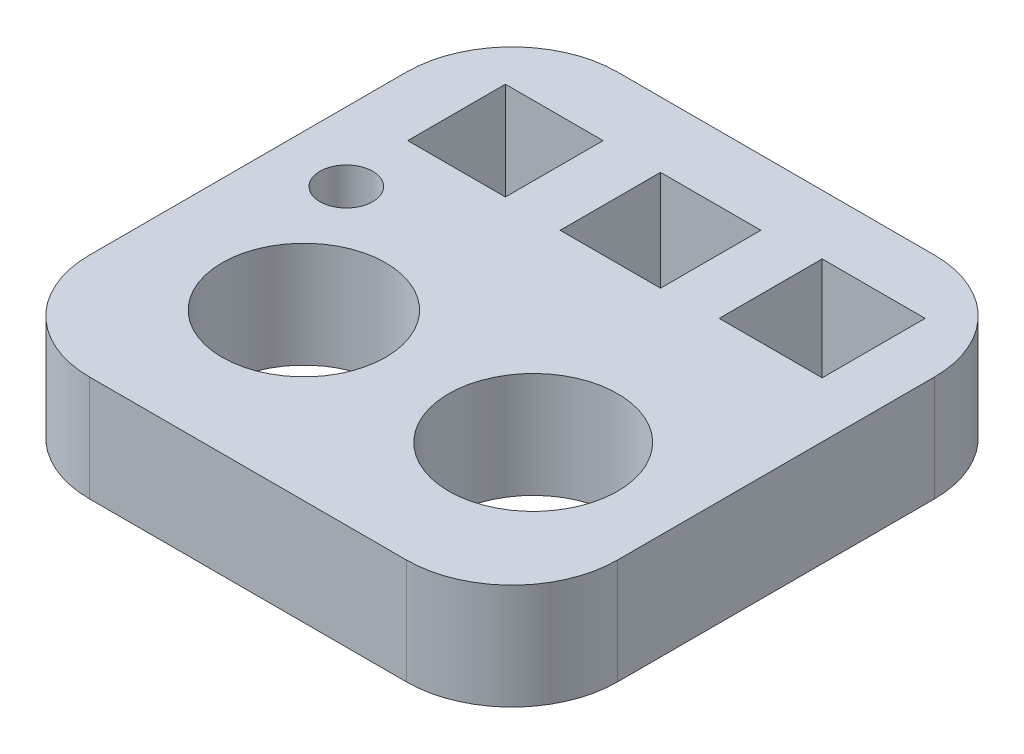
ISO-10303-21;
HEADER;
FILE_DESCRIPTION(('STEP AP214'),'2;1');
FILE_NAME('part.step','',(''),(''),'','','');
FILE_SCHEMA(('AUTOMOTIVE_DESIGN { 1 0 10303 214 1 1 1 1 }'));
ENDSEC;
DATA;
#1=APPLICATION_CONTEXT('core data for automotive mechanical design processes');
#2=APPLICATION_PROTOCOL_DEFINITION('international standard','automotive_design',2000,#1);
#3=PRODUCT_CONTEXT('',#1,'mechanical');
#4=PRODUCT('Part','Part','',(#3));
#5=PRODUCT_RELATED_PRODUCT_CATEGORY('part','',(#4));
#6=PRODUCT_DEFINITION_FORMATION('','',#4);
#7=PRODUCT_DEFINITION_CONTEXT('part definition',#1,'design');
#8=PRODUCT_DEFINITION('design','',#6,#7);
#9=PRODUCT_DEFINITION_SHAPE('','',#8);
#10=(LENGTH_UNIT() NAMED_UNIT(*) SI_UNIT(.MILLI.,.METRE.));
#11=(NAMED_UNIT(*) PLANE_ANGLE_UNIT() SI_UNIT($,.RADIAN.));
#12=(NAMED_UNIT(*) SI_UNIT($,.STERADIAN.) SOLID_ANGLE_UNIT());
#13=UNCERTAINTY_MEASURE_WITH_UNIT(LENGTH_MEASURE(1.E-05),#10,'distance_accuracy_value','');
#14=(GEOMETRIC_REPRESENTATION_CONTEXT(3) GLOBAL_UNCERTAINTY_ASSIGNED_CONTEXT((#13)) GLOBAL_UNIT_ASSIGNED_CONTEXT((#10,
#11,#12)) REPRESENTATION_CONTEXT('',''));
#15=CARTESIAN_POINT('',(0.,0.,0.));
#16=DIRECTION('',(0.,0.,1.));
#17=DIRECTION('',(1.,0.,0.));
#18=AXIS2_PLACEMENT_3D('',#15,#16,#17);
#19=CARTESIAN_POINT('',(-51.0166640577938,2.,33.2925280719129));
#20=DIRECTION('',(1.,0.,0.));
#21=DIRECTION('',(0.,0.,-1.));
#22=AXIS2_PLACEMENT_3D('',#19,#20,#21);
#23=PLANE('',#22);
#24=DIRECTION('',(0.,0.,1.));
#25=VECTOR('',#24,1.);
#26=CARTESIAN_POINT('',(-51.0166640577938,2.,33.2925280719129));
#27=LINE('',#26,#25);
#28=CARTESIAN_POINT('',(-51.0166640577938,2.,35.2925280719129));
#29=VERTEX_POINT('',#28);
#30=CARTESIAN_POINT('',(-51.0166640577938,2.,41.2925280719129));
#31=VERTEX_POINT('',#30);
#32=EDGE_CURVE('E284',#29,#31,#27,.T.);
#33=ORIENTED_EDGE('',*,*,#32,.F.);
#34=DIRECTION('',(0.,-1.,0.));
#35=VECTOR('',#34,1.);
#36=CARTESIAN_POINT('',(-51.0166640577938,2.,35.2925280719129));
#37=LINE('',#36,#35);
#38=CARTESIAN_POINT('',(-51.0166640577938,0.,35.2925280719129));
#39=VERTEX_POINT('',#38);
#40=EDGE_CURVE('E372',#29,#39,#37,.T.);
#41=ORIENTED_EDGE('',*,*,#40,.T.);
#42=DIRECTION('',(0.,0.,1.));
#43=VECTOR('',#42,1.);
#44=CARTESIAN_POINT('',(-51.0166640577938,0.,33.2925280719129));
#45=LINE('',#44,#43);
#46=CARTESIAN_POINT('',(-51.0166640577938,0.,41.2925280719129));
#47=VERTEX_POINT('',#46);
#48=EDGE_CURVE('E300',#39,#47,#45,.T.);
#49=ORIENTED_EDGE('',*,*,#48,.T.);
#50=DIRECTION('',(0.,-1.,0.));
#51=VECTOR('',#50,1.);
#52=CARTESIAN_POINT('',(-51.0166640577938,2.,41.2925280719129));
#53=LINE('',#52,#51);
#54=EDGE_CURVE('E369',#47,#31,#53,.F.);
#55=ORIENTED_EDGE('',*,*,#54,.T.);
#56=EDGE_LOOP('',(#33,#41,#49,#55));
#57=FACE_BOUND('',#56,.T.);
#58=ADVANCED_FACE('F45',(#57),#23,.F.);
#59=CARTESIAN_POINT('',(-51.0166640577938,2.,43.2925280719129));
#60=DIRECTION('',(0.,0.,-1.));
#61=DIRECTION('',(-1.,0.,0.));
#62=AXIS2_PLACEMENT_3D('',#59,#60,#61);
#63=PLANE('',#62);
#64=DIRECTION('',(1.,0.,0.));
#65=VECTOR('',#64,1.);
#66=CARTESIAN_POINT('',(-51.0166640577938,2.,43.2925280719129));
#67=LINE('',#66,#65);
#68=CARTESIAN_POINT('',(-49.0166640577938,2.,43.2925280719129));
#69=VERTEX_POINT('',#68);
#70=CARTESIAN_POINT('',(-43.0166640577938,2.,43.2925280719129));
#71=VERTEX_POINT('',#70);
#72=EDGE_CURVE('E288',#69,#71,#67,.T.);
#73=ORIENTED_EDGE('',*,*,#72,.F.);
#74=DIRECTION('',(0.,-1.,0.));
#75=VECTOR('',#74,1.);
#76=CARTESIAN_POINT('',(-49.0166640577938,2.,43.2925280719129));
#77=LINE('',#76,#75);
#78=CARTESIAN_POINT('',(-49.0166640577938,0.,43.2925280719129));
#79=VERTEX_POINT('',#78);
#80=EDGE_CURVE('E409',#69,#79,#77,.T.);
#81=ORIENTED_EDGE('',*,*,#80,.T.);
#82=DIRECTION('',(1.,0.,0.));
#83=VECTOR('',#82,1.);
#84=CARTESIAN_POINT('',(-51.0166640577938,0.,43.2925280719129));
#85=LINE('',#84,#83);
#86=CARTESIAN_POINT('',(-43.0166640577938,0.,43.2925280719129));
#87=VERTEX_POINT('',#86);
#88=EDGE_CURVE('E304',#79,#87,#85,.T.);
#89=ORIENTED_EDGE('',*,*,#88,.T.);
#90=DIRECTION('',(0.,-1.,0.));
#91=VECTOR('',#90,1.);
#92=CARTESIAN_POINT('',(-43.0166640577938,2.,43.2925280719129));
#93=LINE('',#92,#91);
#94=EDGE_CURVE('E406',#87,#71,#93,.F.);
#95=ORIENTED_EDGE('',*,*,#94,.T.);
#96=EDGE_LOOP('',(#73,#81,#89,#95));
#97=FACE_BOUND('',#96,.T.);
#98=ADVANCED_FACE('F444',(#97),#63,.F.);
#99=CARTESIAN_POINT('',(-41.0166640577938,2.,33.2925280719129));
#100=DIRECTION('',(-1.,0.,0.));
#101=DIRECTION('',(0.,0.,1.));
#102=AXIS2_PLACEMENT_3D('',#99,#100,#101);
#103=PLANE('',#102);
#104=DIRECTION('',(0.,0.,-1.));
#105=VECTOR('',#104,1.);
#106=CARTESIAN_POINT('',(-41.0166640577938,0.,33.2925280719129));
#107=LINE('',#106,#105);
#108=CARTESIAN_POINT('',(-41.0166640577938,0.,41.2925280719129));
#109=VERTEX_POINT('',#108);
#110=CARTESIAN_POINT('',(-41.0166640577938,0.,35.2925280719129));
#111=VERTEX_POINT('',#110);
#112=EDGE_CURVE('E309',#109,#111,#107,.T.);
#113=ORIENTED_EDGE('',*,*,#112,.T.);
#114=DIRECTION('',(0.,-1.,0.));
#115=VECTOR('',#114,1.);
#116=CARTESIAN_POINT('',(-41.0166640577938,2.,35.2925280719129));
#117=LINE('',#116,#115);
#118=CARTESIAN_POINT('',(-41.0166640577938,2.,35.2925280719129));
#119=VERTEX_POINT('',#118);
#120=EDGE_CURVE('E11',#111,#119,#117,.F.);
#121=ORIENTED_EDGE('',*,*,#120,.T.);
#122=DIRECTION('',(0.,0.,-1.));
#123=VECTOR('',#122,1.);
#124=CARTESIAN_POINT('',(-41.0166640577938,2.,33.2925280719129));
#125=LINE('',#124,#123);
#126=CARTESIAN_POINT('',(-41.0166640577938,2.,41.2925280719129));
#127=VERTEX_POINT('',#126);
#128=EDGE_CURVE('E292',#127,#119,#125,.T.);
#129=ORIENTED_EDGE('',*,*,#128,.F.);
#130=DIRECTION('',(0.,-1.,0.));
#131=VECTOR('',#130,1.);
#132=CARTESIAN_POINT('',(-41.0166640577938,2.,41.2925280719129));
#133=LINE('',#132,#131);
#134=EDGE_CURVE('E54',#127,#109,#133,.T.);
#135=ORIENTED_EDGE('',*,*,#134,.T.);
#136=EDGE_LOOP('',(#113,#121,#129,#135));
#137=FACE_BOUND('',#136,.T.);
#138=ADVANCED_FACE('F416',(#137),#103,.F.);
#139=CARTESIAN_POINT('',(-51.0166640577938,2.,33.2925280719129));
#140=DIRECTION('',(0.,0.,1.));
#141=DIRECTION('',(1.,0.,0.));
#142=AXIS2_PLACEMENT_3D('',#139,#140,#141);
#143=PLANE('',#142);
#144=DIRECTION('',(-1.,0.,0.));
#145=VECTOR('',#144,1.);
#146=CARTESIAN_POINT('',(-51.0166640577938,0.,33.2925280719129));
#147=LINE('',#146,#145);
#148=CARTESIAN_POINT('',(-43.0166640577938,0.,33.2925280719129));
#149=VERTEX_POINT('',#148);
#150=CARTESIAN_POINT('',(-49.0166640577938,0.,33.2925280719129));
#151=VERTEX_POINT('',#150);
#152=EDGE_CURVE('E289',#149,#151,#147,.T.);
#153=ORIENTED_EDGE('',*,*,#152,.T.);
#154=DIRECTION('',(0.,-1.,0.));
#155=VECTOR('',#154,1.);
#156=CARTESIAN_POINT('',(-49.0166640577938,2.,33.2925280719129));
#157=LINE('',#156,#155);
#158=CARTESIAN_POINT('',(-49.0166640577938,2.,33.2925280719129));
#159=VERTEX_POINT('',#158);
#160=EDGE_CURVE('E392',#151,#159,#157,.F.);
#161=ORIENTED_EDGE('',*,*,#160,.T.);
#162=DIRECTION('',(-1.,0.,0.));
#163=VECTOR('',#162,1.);
#164=CARTESIAN_POINT('',(-51.0166640577938,2.,33.2925280719129));
#165=LINE('',#164,#163);
#166=CARTESIAN_POINT('',(-43.0166640577938,2.,33.2925280719129));
#167=VERTEX_POINT('',#166);
#168=EDGE_CURVE('E295',#167,#159,#165,.T.);
#169=ORIENTED_EDGE('',*,*,#168,.F.);
#170=DIRECTION('',(0.,-1.,0.));
#171=VECTOR('',#170,1.);
#172=CARTESIAN_POINT('',(-43.0166640577938,2.,33.2925280719129));
#173=LINE('',#172,#171);
#174=EDGE_CURVE('E388',#167,#149,#173,.T.);
#175=ORIENTED_EDGE('',*,*,#174,.T.);
#176=EDGE_LOOP('',(#153,#161,#169,#175));
#177=FACE_BOUND('',#176,.T.);
#178=ADVANCED_FACE('F429',(#177),#143,.F.);
#179=CARTESIAN_POINT('',(0.,2.,0.));
#180=DIRECTION('',(0.,1.,0.));
#181=DIRECTION('',(0.,0.,1.));
#182=AXIS2_PLACEMENT_3D('',#179,#180,#181);
#183=PLANE('',#182);
#184=DIRECTION('',(0.,0.,1.));
#185=VECTOR('',#184,1.);
#186=CARTESIAN_POINT('',(-49.8807943546431,2.,34.5532077276569));
#187=LINE('',#186,#185);
#188=CARTESIAN_POINT('',(-49.8807943546431,2.,34.5532077276569));
#189=VERTEX_POINT('',#188);
#190=CARTESIAN_POINT('',(-49.8807943546431,2.,36.4032077276569));
#191=VERTEX_POINT('',#190);
#192=EDGE_CURVE('E187',#189,#191,#187,.T.);
#193=ORIENTED_EDGE('',*,*,#192,.F.);
#194=DIRECTION('',(-1.,0.,0.));
#195=VECTOR('',#194,1.);
#196=CARTESIAN_POINT('',(-49.8807943546431,2.,34.5532077276569));
#197=LINE('',#196,#195);
#198=CARTESIAN_POINT('',(-48.0307943546431,2.,34.5532077276569));
#199=VERTEX_POINT('',#198);
#200=EDGE_CURVE('E198',#199,#189,#197,.T.);
#201=ORIENTED_EDGE('',*,*,#200,.F.);
#202=DIRECTION('',(0.,0.,-1.));
#203=VECTOR('',#202,1.);
#204=CARTESIAN_POINT('',(-48.0307943546431,2.,34.5532077276569));
#205=LINE('',#204,#203);
#206=CARTESIAN_POINT('',(-48.0307943546431,2.,36.4032077276569));
#207=VERTEX_POINT('',#206);
#208=EDGE_CURVE('E205',#207,#199,#205,.T.);
#209=ORIENTED_EDGE('',*,*,#208,.F.);
#210=DIRECTION('',(1.,0.,0.));
#211=VECTOR('',#210,1.);
#212=CARTESIAN_POINT('',(-49.8807943546431,2.,36.4032077276569));
#213=LINE('',#212,#211);
#214=EDGE_CURVE('E212',#191,#207,#213,.T.);
#215=ORIENTED_EDGE('',*,*,#214,.F.);
#216=EDGE_LOOP('',(#193,#201,#209,#215));
#217=FACE_BOUND('',#216,.T.);
#218=DIRECTION('',(0.,0.,1.));
#219=VECTOR('',#218,1.);
#220=CARTESIAN_POINT('',(-46.9666640577938,2.,34.5299199576132));
#221=LINE('',#220,#219);
#222=CARTESIAN_POINT('',(-46.9666640577938,2.,34.5299199576132));
#223=VERTEX_POINT('',#222);
#224=CARTESIAN_POINT('',(-46.9666640577938,2.,36.4299199576132));
#225=VERTEX_POINT('',#224);
#226=EDGE_CURVE('E195',#223,#225,#221,.T.);
#227=ORIENTED_EDGE('',*,*,#226,.F.);
#228=DIRECTION('',(-1.,0.,0.));
#229=VECTOR('',#228,1.);
#230=CARTESIAN_POINT('',(-46.9666640577938,2.,34.5299199576132));
#231=LINE('',#230,#229);
#232=CARTESIAN_POINT('',(-45.0666640577938,2.,34.5299199576132));
#233=VERTEX_POINT('',#232);
#234=EDGE_CURVE('E227',#233,#223,#231,.T.);
#235=ORIENTED_EDGE('',*,*,#234,.F.);
#236=DIRECTION('',(0.,0.,-1.));
#237=VECTOR('',#236,1.);
#238=CARTESIAN_POINT('',(-45.0666640577938,2.,34.5299199576132));
#239=LINE('',#238,#237);
#240=CARTESIAN_POINT('',(-45.0666640577938,2.,36.4299199576132));
#241=VERTEX_POINT('',#240);
#242=EDGE_CURVE('E241',#241,#233,#239,.T.);
#243=ORIENTED_EDGE('',*,*,#242,.F.);
#244=DIRECTION('',(1.,0.,0.));
#245=VECTOR('',#244,1.);
#246=CARTESIAN_POINT('',(-46.9666640577938,2.,36.4299199576132));
#247=LINE('',#246,#245);
#248=EDGE_CURVE('E245',#225,#241,#247,.T.);
#249=ORIENTED_EDGE('',*,*,#248,.F.);
#250=EDGE_LOOP('',(#227,#235,#243,#249));
#251=FACE_BOUND('',#250,.T.);
#252=CARTESIAN_POINT('',(-48.0855125795582,2.,40.1647504945013));
#253=DIRECTION('',(0.,1.,0.));
#254=DIRECTION('',(0.,0.,1.));
#255=AXIS2_PLACEMENT_3D('',#252,#253,#254);
#256=CIRCLE('',#255,1.55);
#257=CARTESIAN_POINT('',(-48.0855125795582,2.,41.7147504945013));
#258=VERTEX_POINT('',#257);
#259=EDGE_CURVE('E237',#258,#258,#256,.T.);
#260=ORIENTED_EDGE('',*,*,#259,.F.);
#261=EDGE_LOOP('',(#260));
#262=FACE_BOUND('',#261,.T.);
#263=CARTESIAN_POINT('',(-43.7426404760196,2.,40.1647504945013));
#264=DIRECTION('',(0.,1.,0.));
#265=DIRECTION('',(0.,0.,1.));
#266=AXIS2_PLACEMENT_3D('',#263,#264,#265);
#267=CIRCLE('',#266,1.6);
#268=CARTESIAN_POINT('',(-43.7426404760196,2.,41.7647504945013));
#269=VERTEX_POINT('',#268);
#270=EDGE_CURVE('E254',#269,#269,#267,.T.);
#271=ORIENTED_EDGE('',*,*,#270,.F.);
#272=EDGE_LOOP('',(#271));
#273=FACE_BOUND('',#272,.T.);
#274=CARTESIAN_POINT('',(-49.7098151379683,2.,37.7368456177199));
#275=DIRECTION('',(0.,1.,0.));
#276=DIRECTION('',(0.,0.,1.));
#277=AXIS2_PLACEMENT_3D('',#274,#275,#276);
#278=CIRCLE('',#277,0.499999999999999);
#279=CARTESIAN_POINT('',(-49.7098151379683,2.,38.2368456177199));
#280=VERTEX_POINT('',#279);
#281=EDGE_CURVE('E257',#280,#280,#278,.T.);
#282=ORIENTED_EDGE('',*,*,#281,.F.);
#283=EDGE_LOOP('',(#282));
#284=FACE_BOUND('',#283,.T.);
#285=DIRECTION('',(0.,0.,1.));
#286=VECTOR('',#285,1.);
#287=CARTESIAN_POINT('',(-44.0162072226992,2.,34.4190118843219));
#288=LINE('',#287,#286);
#289=CARTESIAN_POINT('',(-44.0162072226992,2.,34.4190118843219));
#290=VERTEX_POINT('',#289);
#291=CARTESIAN_POINT('',(-44.0162072226992,2.,36.3690118843219));
#292=VERTEX_POINT('',#291);
#293=EDGE_CURVE('E214',#290,#292,#288,.T.);
#294=ORIENTED_EDGE('',*,*,#293,.F.);
#295=DIRECTION('',(-1.,0.,0.));
#296=VECTOR('',#295,1.);
#297=CARTESIAN_POINT('',(-44.0162072226992,2.,34.4190118843219));
#298=LINE('',#297,#296);
#299=CARTESIAN_POINT('',(-42.0662072226992,2.,34.4190118843219));
#300=VERTEX_POINT('',#299);
#301=EDGE_CURVE('E266',#300,#290,#298,.T.);
#302=ORIENTED_EDGE('',*,*,#301,.F.);
#303=DIRECTION('',(0.,0.,-1.));
#304=VECTOR('',#303,1.);
#305=CARTESIAN_POINT('',(-42.0662072226992,2.,34.4190118843219));
#306=LINE('',#305,#304);
#307=CARTESIAN_POINT('',(-42.0662072226992,2.,36.3690118843219));
#308=VERTEX_POINT('',#307);
#309=EDGE_CURVE('E262',#308,#300,#306,.T.);
#310=ORIENTED_EDGE('',*,*,#309,.F.);
#311=DIRECTION('',(1.,0.,0.));
#312=VECTOR('',#311,1.);
#313=CARTESIAN_POINT('',(-44.0162072226992,2.,36.3690118843219));
#314=LINE('',#313,#312);
#315=EDGE_CURVE('E218',#292,#308,#314,.T.);
#316=ORIENTED_EDGE('',*,*,#315,.F.);
#317=EDGE_LOOP('',(#294,#302,#310,#316));
#318=FACE_BOUND('',#317,.T.);
#319=ORIENTED_EDGE('',*,*,#168,.T.);
#320=CARTESIAN_POINT('',(-49.0166640577938,2.,35.2925280719129));
#321=DIRECTION('',(0.,1.,0.));
#322=DIRECTION('',(0.,0.,1.));
#323=AXIS2_PLACEMENT_3D('',#320,#321,#322);
#324=CIRCLE('',#323,2.);
#325=EDGE_CURVE('E403',#159,#29,#324,.T.);
#326=ORIENTED_EDGE('',*,*,#325,.T.);
#327=ORIENTED_EDGE('',*,*,#32,.T.);
#328=CARTESIAN_POINT('',(-49.0166640577938,2.,41.2925280719129));
#329=DIRECTION('',(0.,1.,0.));
#330=DIRECTION('',(0.,0.,1.));
#331=AXIS2_PLACEMENT_3D('',#328,#329,#330);
#332=CIRCLE('',#331,2.);
#333=EDGE_CURVE('E400',#31,#69,#332,.T.);
#334=ORIENTED_EDGE('',*,*,#333,.T.);
#335=ORIENTED_EDGE('',*,*,#72,.T.);
#336=CARTESIAN_POINT('',(-43.0166640577938,2.,41.2925280719129));
#337=DIRECTION('',(0.,1.,0.));
#338=DIRECTION('',(0.,0.,1.));
#339=AXIS2_PLACEMENT_3D('',#336,#337,#338);
#340=CIRCLE('',#339,2.);
#341=EDGE_CURVE('E66',#71,#127,#340,.T.);
#342=ORIENTED_EDGE('',*,*,#341,.T.);
#343=ORIENTED_EDGE('',*,*,#128,.T.);
#344=CARTESIAN_POINT('',(-43.0166640577938,2.,35.2925280719129));
#345=DIRECTION('',(0.,1.,0.));
#346=DIRECTION('',(0.,0.,1.));
#347=AXIS2_PLACEMENT_3D('',#344,#345,#346);
#348=CIRCLE('',#347,2.);
#349=EDGE_CURVE('E397',#119,#167,#348,.T.);
#350=ORIENTED_EDGE('',*,*,#349,.T.);
#351=EDGE_LOOP('',(#319,#326,#327,#334,#335,#342,#343,#350));
#352=FACE_BOUND('',#351,.T.);
#353=ADVANCED_FACE('F209',(#217,#251,#262,#273,#284,#318,#352),#183,.T.);
#354=CARTESIAN_POINT('',(0.,0.,0.));
#355=DIRECTION('',(0.,1.,0.));
#356=DIRECTION('',(0.,0.,1.));
#357=AXIS2_PLACEMENT_3D('',#354,#355,#356);
#358=PLANE('',#357);
#359=DIRECTION('',(-1.,0.,0.));
#360=VECTOR('',#359,1.);
#361=CARTESIAN_POINT('',(0.,0.,34.5532077276569));
#362=LINE('',#361,#360);
#363=CARTESIAN_POINT('',(-48.0307943546431,0.,34.5532077276569));
#364=VERTEX_POINT('',#363);
#365=CARTESIAN_POINT('',(-49.8807943546431,0.,34.5532077276569));
#366=VERTEX_POINT('',#365);
#367=EDGE_CURVE('E364',#364,#366,#362,.T.);
#368=ORIENTED_EDGE('',*,*,#367,.T.);
#369=DIRECTION('',(0.,0.,1.));
#370=VECTOR('',#369,1.);
#371=CARTESIAN_POINT('',(-49.8807943546431,0.,0.));
#372=LINE('',#371,#370);
#373=CARTESIAN_POINT('',(-49.8807943546431,0.,36.4032077276569));
#374=VERTEX_POINT('',#373);
#375=EDGE_CURVE('E190',#366,#374,#372,.T.);
#376=ORIENTED_EDGE('',*,*,#375,.T.);
#377=DIRECTION('',(1.,0.,0.));
#378=VECTOR('',#377,1.);
#379=CARTESIAN_POINT('',(0.,0.,36.4032077276569));
#380=LINE('',#379,#378);
#381=CARTESIAN_POINT('',(-48.0307943546431,0.,36.4032077276569));
#382=VERTEX_POINT('',#381);
#383=EDGE_CURVE('E356',#374,#382,#380,.T.);
#384=ORIENTED_EDGE('',*,*,#383,.T.);
#385=DIRECTION('',(0.,0.,-1.));
#386=VECTOR('',#385,1.);
#387=CARTESIAN_POINT('',(-48.0307943546431,0.,0.));
#388=LINE('',#387,#386);
#389=EDGE_CURVE('E360',#382,#364,#388,.T.);
#390=ORIENTED_EDGE('',*,*,#389,.T.);
#391=EDGE_LOOP('',(#368,#376,#384,#390));
#392=FACE_BOUND('',#391,.T.);
#393=DIRECTION('',(-1.,0.,0.));
#394=VECTOR('',#393,1.);
#395=CARTESIAN_POINT('',(0.,0.,34.5299199576132));
#396=LINE('',#395,#394);
#397=CARTESIAN_POINT('',(-45.0666640577938,0.,34.5299199576132));
#398=VERTEX_POINT('',#397);
#399=CARTESIAN_POINT('',(-46.9666640577938,0.,34.5299199576132));
#400=VERTEX_POINT('',#399);
#401=EDGE_CURVE('E348',#398,#400,#396,.T.);
#402=ORIENTED_EDGE('',*,*,#401,.T.);
#403=DIRECTION('',(0.,0.,1.));
#404=VECTOR('',#403,1.);
#405=CARTESIAN_POINT('',(-46.9666640577938,0.,0.));
#406=LINE('',#405,#404);
#407=CARTESIAN_POINT('',(-46.9666640577938,0.,36.4299199576132));
#408=VERTEX_POINT('',#407);
#409=EDGE_CURVE('E352',#400,#408,#406,.T.);
#410=ORIENTED_EDGE('',*,*,#409,.T.);
#411=DIRECTION('',(1.,0.,0.));
#412=VECTOR('',#411,1.);
#413=CARTESIAN_POINT('',(0.,0.,36.4299199576132));
#414=LINE('',#413,#412);
#415=CARTESIAN_POINT('',(-45.0666640577938,0.,36.4299199576132));
#416=VERTEX_POINT('',#415);
#417=EDGE_CURVE('E330',#408,#416,#414,.T.);
#418=ORIENTED_EDGE('',*,*,#417,.T.);
#419=DIRECTION('',(0.,0.,-1.));
#420=VECTOR('',#419,1.);
#421=CARTESIAN_POINT('',(-45.0666640577938,0.,0.));
#422=LINE('',#421,#420);
#423=EDGE_CURVE('E344',#416,#398,#422,.T.);
#424=ORIENTED_EDGE('',*,*,#423,.T.);
#425=EDGE_LOOP('',(#402,#410,#418,#424));
#426=FACE_BOUND('',#425,.T.);
#427=CARTESIAN_POINT('',(-48.0855125795582,0.,40.1647504945013));
#428=DIRECTION('',(0.,1.,0.));
#429=DIRECTION('',(0.,0.,1.));
#430=AXIS2_PLACEMENT_3D('',#427,#428,#429);
#431=CIRCLE('',#430,1.55);
#432=CARTESIAN_POINT('',(-48.0855125795582,0.,41.7147504945013));
#433=VERTEX_POINT('',#432);
#434=EDGE_CURVE('E305',#433,#433,#431,.T.);
#435=ORIENTED_EDGE('',*,*,#434,.T.);
#436=EDGE_LOOP('',(#435));
#437=FACE_BOUND('',#436,.T.);
#438=CARTESIAN_POINT('',(-43.7426404760196,0.,40.1647504945013));
#439=DIRECTION('',(0.,1.,0.));
#440=DIRECTION('',(0.,0.,1.));
#441=AXIS2_PLACEMENT_3D('',#438,#439,#440);
#442=CIRCLE('',#441,1.6);
#443=CARTESIAN_POINT('',(-43.7426404760196,0.,41.7647504945013));
#444=VERTEX_POINT('',#443);
#445=EDGE_CURVE('E334',#444,#444,#442,.T.);
#446=ORIENTED_EDGE('',*,*,#445,.T.);
#447=EDGE_LOOP('',(#446));
#448=FACE_BOUND('',#447,.T.);
#449=CARTESIAN_POINT('',(-49.7098151379683,0.,37.7368456177199));
#450=DIRECTION('',(0.,1.,0.));
#451=DIRECTION('',(0.,0.,1.));
#452=AXIS2_PLACEMENT_3D('',#449,#450,#451);
#453=CIRCLE('',#452,0.499999999999999);
#454=CARTESIAN_POINT('',(-49.7098151379683,0.,38.2368456177199));
#455=VERTEX_POINT('',#454);
#456=EDGE_CURVE('E274',#455,#455,#453,.T.);
#457=ORIENTED_EDGE('',*,*,#456,.T.);
#458=EDGE_LOOP('',(#457));
#459=FACE_BOUND('',#458,.T.);
#460=DIRECTION('',(-1.,0.,0.));
#461=VECTOR('',#460,1.);
#462=CARTESIAN_POINT('',(0.,0.,34.4190118843219));
#463=LINE('',#462,#461);
#464=CARTESIAN_POINT('',(-42.0662072226992,0.,34.4190118843219));
#465=VERTEX_POINT('',#464);
#466=CARTESIAN_POINT('',(-44.0162072226992,0.,34.4190118843219));
#467=VERTEX_POINT('',#466);
#468=EDGE_CURVE('E322',#465,#467,#463,.T.);
#469=ORIENTED_EDGE('',*,*,#468,.T.);
#470=DIRECTION('',(0.,0.,1.));
#471=VECTOR('',#470,1.);
#472=CARTESIAN_POINT('',(-44.0162072226992,0.,0.));
#473=LINE('',#472,#471);
#474=CARTESIAN_POINT('',(-44.0162072226992,0.,36.3690118843219));
#475=VERTEX_POINT('',#474);
#476=EDGE_CURVE('E326',#467,#475,#473,.T.);
#477=ORIENTED_EDGE('',*,*,#476,.T.);
#478=DIRECTION('',(1.,0.,0.));
#479=VECTOR('',#478,1.);
#480=CARTESIAN_POINT('',(0.,0.,36.3690118843219));
#481=LINE('',#480,#479);
#482=CARTESIAN_POINT('',(-42.0662072226992,0.,36.3690118843219));
#483=VERTEX_POINT('',#482);
#484=EDGE_CURVE('E299',#475,#483,#481,.T.);
#485=ORIENTED_EDGE('',*,*,#484,.T.);
#486=DIRECTION('',(0.,0.,-1.));
#487=VECTOR('',#486,1.);
#488=CARTESIAN_POINT('',(-42.0662072226992,0.,0.));
#489=LINE('',#488,#487);
#490=EDGE_CURVE('E318',#483,#465,#489,.T.);
#491=ORIENTED_EDGE('',*,*,#490,.T.);
#492=EDGE_LOOP('',(#469,#477,#485,#491));
#493=FACE_BOUND('',#492,.T.);
#494=ORIENTED_EDGE('',*,*,#48,.F.);
#495=CARTESIAN_POINT('',(-49.0166640577938,0.,35.2925280719129));
#496=DIRECTION('',(0.,1.,0.));
#497=DIRECTION('',(0.,0.,1.));
#498=AXIS2_PLACEMENT_3D('',#495,#496,#497);
#499=CIRCLE('',#498,2.);
#500=EDGE_CURVE('E385',#39,#151,#499,.F.);
#501=ORIENTED_EDGE('',*,*,#500,.T.);
#502=ORIENTED_EDGE('',*,*,#152,.F.);
#503=CARTESIAN_POINT('',(-43.0166640577938,0.,35.2925280719129));
#504=DIRECTION('',(0.,1.,0.));
#505=DIRECTION('',(0.,0.,1.));
#506=AXIS2_PLACEMENT_3D('',#503,#504,#505);
#507=CIRCLE('',#506,2.);
#508=EDGE_CURVE('E379',#149,#111,#507,.F.);
#509=ORIENTED_EDGE('',*,*,#508,.T.);
#510=ORIENTED_EDGE('',*,*,#112,.F.);
#511=CARTESIAN_POINT('',(-43.0166640577938,0.,41.2925280719129));
#512=DIRECTION('',(0.,1.,0.));
#513=DIRECTION('',(0.,0.,1.));
#514=AXIS2_PLACEMENT_3D('',#511,#512,#513);
#515=CIRCLE('',#514,2.);
#516=EDGE_CURVE('E376',#109,#87,#515,.F.);
#517=ORIENTED_EDGE('',*,*,#516,.T.);
#518=ORIENTED_EDGE('',*,*,#88,.F.);
#519=CARTESIAN_POINT('',(-49.0166640577938,0.,41.2925280719129));
#520=DIRECTION('',(0.,1.,0.));
#521=DIRECTION('',(0.,0.,1.));
#522=AXIS2_PLACEMENT_3D('',#519,#520,#521);
#523=CIRCLE('',#522,2.);
#524=EDGE_CURVE('E382',#79,#47,#523,.F.);
#525=ORIENTED_EDGE('',*,*,#524,.T.);
#526=EDGE_LOOP('',(#494,#501,#502,#509,#510,#517,#518,#525));
#527=FACE_BOUND('',#526,.T.);
#528=ADVANCED_FACE('F420',(#392,#426,#437,#448,#459,#493,#527),#358,.F.);
#529=CARTESIAN_POINT('',(-44.0162072226992,-8.,34.4190118843219));
#530=DIRECTION('',(-1.,0.,0.));
#531=DIRECTION('',(0.,0.,1.));
#532=AXIS2_PLACEMENT_3D('',#529,#530,#531);
#533=PLANE('',#532);
#534=DIRECTION('',(0.,1.,0.));
#535=VECTOR('',#534,1.);
#536=CARTESIAN_POINT('',(-44.0162072226992,-8.,34.4190118843219));
#537=LINE('',#536,#535);
#538=EDGE_CURVE('E271',#467,#290,#537,.T.);
#539=ORIENTED_EDGE('',*,*,#538,.T.);
#540=ORIENTED_EDGE('',*,*,#293,.T.);
#541=DIRECTION('',(0.,1.,0.));
#542=VECTOR('',#541,1.);
#543=CARTESIAN_POINT('',(-44.0162072226992,-8.,36.3690118843219));
#544=LINE('',#543,#542);
#545=EDGE_CURVE('E270',#475,#292,#544,.T.);
#546=ORIENTED_EDGE('',*,*,#545,.F.);
#547=ORIENTED_EDGE('',*,*,#476,.F.);
#548=EDGE_LOOP('',(#539,#540,#546,#547));
#549=FACE_BOUND('',#548,.T.);
#550=ADVANCED_FACE('F603',(#549),#533,.F.);
#551=CARTESIAN_POINT('',(-44.0162072226992,-8.,34.4190118843219));
#552=DIRECTION('',(0.,0.,-1.));
#553=DIRECTION('',(-1.,0.,0.));
#554=AXIS2_PLACEMENT_3D('',#551,#552,#553);
#555=PLANE('',#554);
#556=DIRECTION('',(0.,1.,0.));
#557=VECTOR('',#556,1.);
#558=CARTESIAN_POINT('',(-42.0662072226992,-8.,34.4190118843219));
#559=LINE('',#558,#557);
#560=EDGE_CURVE('E275',#465,#300,#559,.T.);
#561=ORIENTED_EDGE('',*,*,#560,.T.);
#562=ORIENTED_EDGE('',*,*,#301,.T.);
#563=ORIENTED_EDGE('',*,*,#538,.F.);
#564=ORIENTED_EDGE('',*,*,#468,.F.);
#565=EDGE_LOOP('',(#561,#562,#563,#564));
#566=FACE_BOUND('',#565,.T.);
#567=ADVANCED_FACE('F594',(#566),#555,.F.);
#568=CARTESIAN_POINT('',(-42.0662072226992,-8.,34.4190118843219));
#569=DIRECTION('',(1.,0.,0.));
#570=DIRECTION('',(0.,0.,-1.));
#571=AXIS2_PLACEMENT_3D('',#568,#569,#570);
#572=PLANE('',#571);
#573=DIRECTION('',(0.,1.,0.));
#574=VECTOR('',#573,1.);
#575=CARTESIAN_POINT('',(-42.0662072226992,-8.,36.3690118843219));
#576=LINE('',#575,#574);
#577=EDGE_CURVE('E278',#483,#308,#576,.T.);
#578=ORIENTED_EDGE('',*,*,#577,.T.);
#579=ORIENTED_EDGE('',*,*,#309,.T.);
#580=ORIENTED_EDGE('',*,*,#560,.F.);
#581=ORIENTED_EDGE('',*,*,#490,.F.);
#582=EDGE_LOOP('',(#578,#579,#580,#581));
#583=FACE_BOUND('',#582,.T.);
#584=ADVANCED_FACE('F585',(#583),#572,.F.);
#585=CARTESIAN_POINT('',(-44.0162072226992,-8.,36.3690118843219));
#586=DIRECTION('',(0.,0.,1.));
#587=DIRECTION('',(1.,0.,0.));
#588=AXIS2_PLACEMENT_3D('',#585,#586,#587);
#589=PLANE('',#588);
#590=ORIENTED_EDGE('',*,*,#545,.T.);
#591=ORIENTED_EDGE('',*,*,#315,.T.);
#592=ORIENTED_EDGE('',*,*,#577,.F.);
#593=ORIENTED_EDGE('',*,*,#484,.F.);
#594=EDGE_LOOP('',(#590,#591,#592,#593));
#595=FACE_BOUND('',#594,.T.);
#596=ADVANCED_FACE('F576',(#595),#589,.F.);
#597=CARTESIAN_POINT('',(-49.7098151379683,-8.,37.7368456177199));
#598=DIRECTION('',(0.,1.,0.));
#599=DIRECTION('',(0.,0.,1.));
#600=AXIS2_PLACEMENT_3D('',#597,#598,#599);
#601=CYLINDRICAL_SURFACE('',#600,0.499999999999999);
#602=ORIENTED_EDGE('',*,*,#281,.T.);
#603=EDGE_LOOP('',(#602));
#604=FACE_BOUND('',#603,.T.);
#605=ORIENTED_EDGE('',*,*,#456,.F.);
#606=EDGE_LOOP('',(#605));
#607=FACE_BOUND('',#606,.T.);
#608=ADVANCED_FACE('F567',(#604,#607),#601,.F.);
#609=CARTESIAN_POINT('',(-43.7426404760196,-8.,40.1647504945013));
#610=DIRECTION('',(0.,1.,0.));
#611=DIRECTION('',(0.,0.,1.));
#612=AXIS2_PLACEMENT_3D('',#609,#610,#611);
#613=CYLINDRICAL_SURFACE('',#612,1.6);
#614=ORIENTED_EDGE('',*,*,#270,.T.);
#615=EDGE_LOOP('',(#614));
#616=FACE_BOUND('',#615,.T.);
#617=ORIENTED_EDGE('',*,*,#445,.F.);
#618=EDGE_LOOP('',(#617));
#619=FACE_BOUND('',#618,.T.);
#620=ADVANCED_FACE('F558',(#616,#619),#613,.F.);
#621=CARTESIAN_POINT('',(-48.0855125795582,-8.,40.1647504945013));
#622=DIRECTION('',(0.,1.,0.));
#623=DIRECTION('',(0.,0.,1.));
#624=AXIS2_PLACEMENT_3D('',#621,#622,#623);
#625=CYLINDRICAL_SURFACE('',#624,1.55);
#626=ORIENTED_EDGE('',*,*,#259,.T.);
#627=EDGE_LOOP('',(#626));
#628=FACE_BOUND('',#627,.T.);
#629=ORIENTED_EDGE('',*,*,#434,.F.);
#630=EDGE_LOOP('',(#629));
#631=FACE_BOUND('',#630,.T.);
#632=ADVANCED_FACE('F549',(#628,#631),#625,.F.);
#633=CARTESIAN_POINT('',(-46.9666640577938,-8.,34.5299199576132));
#634=DIRECTION('',(-1.,0.,0.));
#635=DIRECTION('',(0.,0.,1.));
#636=AXIS2_PLACEMENT_3D('',#633,#634,#635);
#637=PLANE('',#636);
#638=DIRECTION('',(0.,1.,0.));
#639=VECTOR('',#638,1.);
#640=CARTESIAN_POINT('',(-46.9666640577938,-8.,34.5299199576132));
#641=LINE('',#640,#639);
#642=EDGE_CURVE('E234',#400,#223,#641,.T.);
#643=ORIENTED_EDGE('',*,*,#642,.T.);
#644=ORIENTED_EDGE('',*,*,#226,.T.);
#645=DIRECTION('',(0.,1.,0.));
#646=VECTOR('',#645,1.);
#647=CARTESIAN_POINT('',(-46.9666640577938,-8.,36.4299199576132));
#648=LINE('',#647,#646);
#649=EDGE_CURVE('E223',#408,#225,#648,.T.);
#650=ORIENTED_EDGE('',*,*,#649,.F.);
#651=ORIENTED_EDGE('',*,*,#409,.F.);
#652=EDGE_LOOP('',(#643,#644,#650,#651));
#653=FACE_BOUND('',#652,.T.);
#654=ADVANCED_FACE('F540',(#653),#637,.F.);
#655=CARTESIAN_POINT('',(-46.9666640577938,-8.,34.5299199576132));
#656=DIRECTION('',(0.,0.,-1.));
#657=DIRECTION('',(-1.,0.,0.));
#658=AXIS2_PLACEMENT_3D('',#655,#656,#657);
#659=PLANE('',#658);
#660=DIRECTION('',(0.,1.,0.));
#661=VECTOR('',#660,1.);
#662=CARTESIAN_POINT('',(-45.0666640577938,-8.,34.5299199576132));
#663=LINE('',#662,#661);
#664=EDGE_CURVE('E231',#398,#233,#663,.T.);
#665=ORIENTED_EDGE('',*,*,#664,.T.);
#666=ORIENTED_EDGE('',*,*,#234,.T.);
#667=ORIENTED_EDGE('',*,*,#642,.F.);
#668=ORIENTED_EDGE('',*,*,#401,.F.);
#669=EDGE_LOOP('',(#665,#666,#667,#668));
#670=FACE_BOUND('',#669,.T.);
#671=ADVANCED_FACE('F531',(#670),#659,.F.);
#672=CARTESIAN_POINT('',(-45.0666640577938,-8.,34.5299199576132));
#673=DIRECTION('',(1.,0.,0.));
#674=DIRECTION('',(0.,0.,-1.));
#675=AXIS2_PLACEMENT_3D('',#672,#673,#674);
#676=PLANE('',#675);
#677=DIRECTION('',(0.,1.,0.));
#678=VECTOR('',#677,1.);
#679=CARTESIAN_POINT('',(-45.0666640577938,-8.,36.4299199576132));
#680=LINE('',#679,#678);
#681=EDGE_CURVE('E228',#416,#241,#680,.T.);
#682=ORIENTED_EDGE('',*,*,#681,.T.);
#683=ORIENTED_EDGE('',*,*,#242,.T.);
#684=ORIENTED_EDGE('',*,*,#664,.F.);
#685=ORIENTED_EDGE('',*,*,#423,.F.);
#686=EDGE_LOOP('',(#682,#683,#684,#685));
#687=FACE_BOUND('',#686,.T.);
#688=ADVANCED_FACE('F522',(#687),#676,.F.);
#689=CARTESIAN_POINT('',(-46.9666640577938,-8.,36.4299199576132));
#690=DIRECTION('',(0.,0.,1.));
#691=DIRECTION('',(1.,0.,0.));
#692=AXIS2_PLACEMENT_3D('',#689,#690,#691);
#693=PLANE('',#692);
#694=ORIENTED_EDGE('',*,*,#649,.T.);
#695=ORIENTED_EDGE('',*,*,#248,.T.);
#696=ORIENTED_EDGE('',*,*,#681,.F.);
#697=ORIENTED_EDGE('',*,*,#417,.F.);
#698=EDGE_LOOP('',(#694,#695,#696,#697));
#699=FACE_BOUND('',#698,.T.);
#700=ADVANCED_FACE('F514',(#699),#693,.F.);
#701=CARTESIAN_POINT('',(-49.8807943546431,-8.,34.5532077276569));
#702=DIRECTION('',(-1.,0.,0.));
#703=DIRECTION('',(0.,0.,1.));
#704=AXIS2_PLACEMENT_3D('',#701,#702,#703);
#705=PLANE('',#704);
#706=DIRECTION('',(0.,1.,0.));
#707=VECTOR('',#706,1.);
#708=CARTESIAN_POINT('',(-49.8807943546431,-8.,34.5532077276569));
#709=LINE('',#708,#707);
#710=EDGE_CURVE('E182',#366,#189,#709,.T.);
#711=ORIENTED_EDGE('',*,*,#710,.T.);
#712=ORIENTED_EDGE('',*,*,#192,.T.);
#713=DIRECTION('',(0.,1.,0.));
#714=VECTOR('',#713,1.);
#715=CARTESIAN_POINT('',(-49.8807943546431,-8.,36.4032077276569));
#716=LINE('',#715,#714);
#717=EDGE_CURVE('E206',#374,#191,#716,.T.);
#718=ORIENTED_EDGE('',*,*,#717,.F.);
#719=ORIENTED_EDGE('',*,*,#375,.F.);
#720=EDGE_LOOP('',(#711,#712,#718,#719));
#721=FACE_BOUND('',#720,.T.);
#722=ADVANCED_FACE('F184',(#721),#705,.F.);
#723=CARTESIAN_POINT('',(-49.8807943546431,-8.,34.5532077276569));
#724=DIRECTION('',(0.,0.,-1.));
#725=DIRECTION('',(-1.,0.,0.));
#726=AXIS2_PLACEMENT_3D('',#723,#724,#725);
#727=PLANE('',#726);
#728=DIRECTION('',(0.,1.,0.));
#729=VECTOR('',#728,1.);
#730=CARTESIAN_POINT('',(-48.0307943546431,-8.,34.5532077276569));
#731=LINE('',#730,#729);
#732=EDGE_CURVE('E194',#364,#199,#731,.T.);
#733=ORIENTED_EDGE('',*,*,#732,.T.);
#734=ORIENTED_EDGE('',*,*,#200,.T.);
#735=ORIENTED_EDGE('',*,*,#710,.F.);
#736=ORIENTED_EDGE('',*,*,#367,.F.);
#737=EDGE_LOOP('',(#733,#734,#735,#736));
#738=FACE_BOUND('',#737,.T.);
#739=ADVANCED_FACE('F199',(#738),#727,.F.);
#740=CARTESIAN_POINT('',(-48.0307943546431,-8.,34.5532077276569));
#741=DIRECTION('',(1.,0.,0.));
#742=DIRECTION('',(0.,0.,-1.));
#743=AXIS2_PLACEMENT_3D('',#740,#741,#742);
#744=PLANE('',#743);
#745=DIRECTION('',(0.,1.,0.));
#746=VECTOR('',#745,1.);
#747=CARTESIAN_POINT('',(-48.0307943546431,-8.,36.4032077276569));
#748=LINE('',#747,#746);
#749=EDGE_CURVE('E696',#382,#207,#748,.T.);
#750=ORIENTED_EDGE('',*,*,#749,.T.);
#751=ORIENTED_EDGE('',*,*,#208,.T.);
#752=ORIENTED_EDGE('',*,*,#732,.F.);
#753=ORIENTED_EDGE('',*,*,#389,.F.);
#754=EDGE_LOOP('',(#750,#751,#752,#753));
#755=FACE_BOUND('',#754,.T.);
#756=ADVANCED_FACE('F490',(#755),#744,.F.);
#757=CARTESIAN_POINT('',(-49.8807943546431,-8.,36.4032077276569));
#758=DIRECTION('',(0.,0.,1.));
#759=DIRECTION('',(1.,0.,0.));
#760=AXIS2_PLACEMENT_3D('',#757,#758,#759);
#761=PLANE('',#760);
#762=ORIENTED_EDGE('',*,*,#717,.T.);
#763=ORIENTED_EDGE('',*,*,#214,.T.);
#764=ORIENTED_EDGE('',*,*,#749,.F.);
#765=ORIENTED_EDGE('',*,*,#383,.F.);
#766=EDGE_LOOP('',(#762,#763,#764,#765));
#767=FACE_BOUND('',#766,.T.);
#768=ADVANCED_FACE('F461',(#767),#761,.F.);
#769=CARTESIAN_POINT('',(-49.0166640577938,2.,35.2925280719129));
#770=DIRECTION('',(0.,-1.,0.));
#771=DIRECTION('',(0.,0.,-1.));
#772=AXIS2_PLACEMENT_3D('',#769,#770,#771);
#773=CYLINDRICAL_SURFACE('',#772,2.);
#774=ORIENTED_EDGE('',*,*,#325,.F.);
#775=ORIENTED_EDGE('',*,*,#160,.F.);
#776=ORIENTED_EDGE('',*,*,#500,.F.);
#777=ORIENTED_EDGE('',*,*,#40,.F.);
#778=EDGE_LOOP('',(#774,#775,#776,#777));
#779=FACE_BOUND('',#778,.T.);
#780=ADVANCED_FACE('F435',(#779),#773,.T.);
#781=CARTESIAN_POINT('',(-49.0166640577938,2.,41.2925280719129));
#782=DIRECTION('',(0.,-1.,0.));
#783=DIRECTION('',(0.,0.,-1.));
#784=AXIS2_PLACEMENT_3D('',#781,#782,#783);
#785=CYLINDRICAL_SURFACE('',#784,2.);
#786=ORIENTED_EDGE('',*,*,#333,.F.);
#787=ORIENTED_EDGE('',*,*,#54,.F.);
#788=ORIENTED_EDGE('',*,*,#524,.F.);
#789=ORIENTED_EDGE('',*,*,#80,.F.);
#790=EDGE_LOOP('',(#786,#787,#788,#789));
#791=FACE_BOUND('',#790,.T.);
#792=ADVANCED_FACE('F441',(#791),#785,.T.);
#793=CARTESIAN_POINT('',(-43.0166640577938,2.,35.2925280719129));
#794=DIRECTION('',(0.,-1.,0.));
#795=DIRECTION('',(0.,0.,-1.));
#796=AXIS2_PLACEMENT_3D('',#793,#794,#795);
#797=CYLINDRICAL_SURFACE('',#796,2.);
#798=ORIENTED_EDGE('',*,*,#349,.F.);
#799=ORIENTED_EDGE('',*,*,#120,.F.);
#800=ORIENTED_EDGE('',*,*,#508,.F.);
#801=ORIENTED_EDGE('',*,*,#174,.F.);
#802=EDGE_LOOP('',(#798,#799,#800,#801));
#803=FACE_BOUND('',#802,.T.);
#804=ADVANCED_FACE('F426',(#803),#797,.T.);
#805=CARTESIAN_POINT('',(-43.0166640577938,2.,41.2925280719129));
#806=DIRECTION('',(0.,-1.,0.));
#807=DIRECTION('',(0.,0.,-1.));
#808=AXIS2_PLACEMENT_3D('',#805,#806,#807);
#809=CYLINDRICAL_SURFACE('',#808,2.);
#810=ORIENTED_EDGE('',*,*,#341,.F.);
#811=ORIENTED_EDGE('',*,*,#94,.F.);
#812=ORIENTED_EDGE('',*,*,#516,.F.);
#813=ORIENTED_EDGE('',*,*,#134,.F.);
#814=EDGE_LOOP('',(#810,#811,#812,#813));
#815=FACE_BOUND('',#814,.T.);
#816=ADVANCED_FACE('F47',(#815),#809,.T.);
#817=CLOSED_SHELL('',(#58,#98,#138,#178,#353,#528,#550,#567,#584,#596,#608,#620,#632,#654,#671,
#688,#700,#722,#739,#756,#768,#780,#792,#804,#816));
#818=MANIFOLD_SOLID_BREP('B2',#817);
#819=ADVANCED_BREP_SHAPE_REPRESENTATION('',(#18,#818),#14);
#820=SHAPE_DEFINITION_REPRESENTATION(#9,#819);
ENDSEC;
END-ISO-10303-21;
